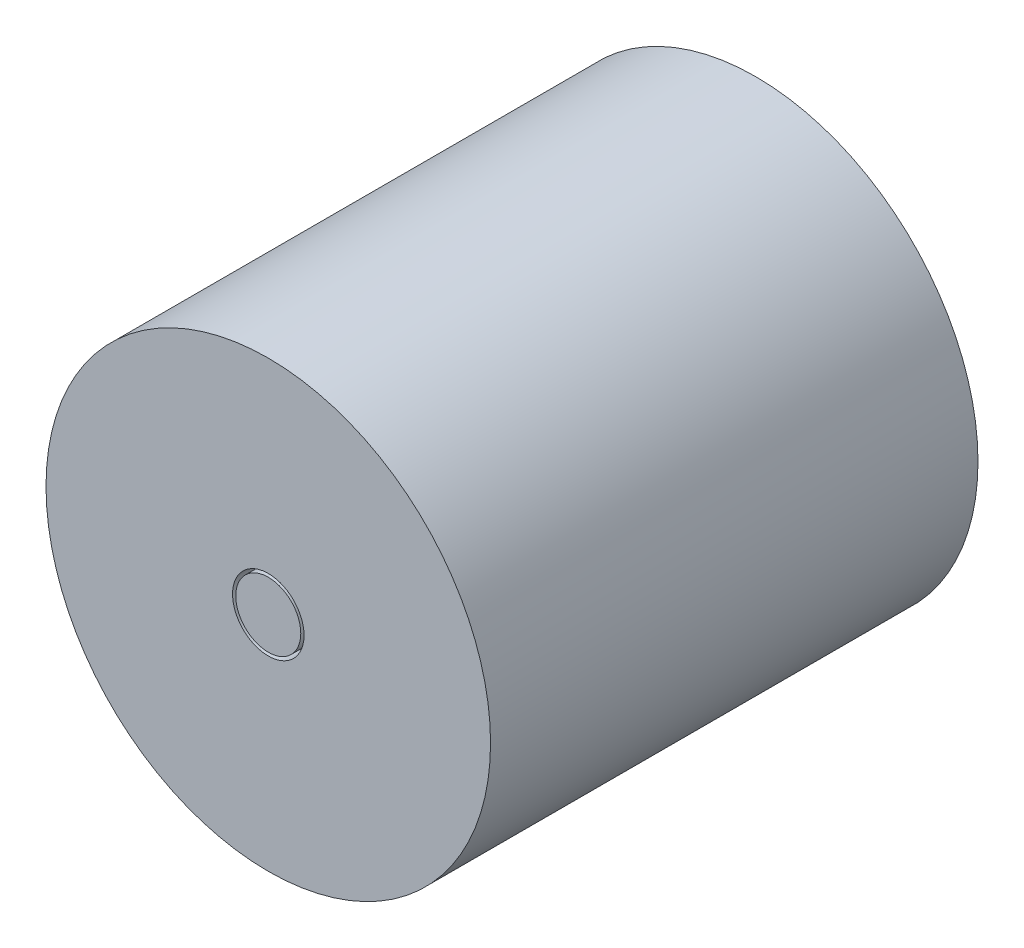
ISO-10303-21;
HEADER;
FILE_DESCRIPTION(('STEP AP214'),'2;1');
FILE_NAME('part.step','',(''),(''),'','','');
FILE_SCHEMA(('AUTOMOTIVE_DESIGN { 1 0 10303 214 1 1 1 1 }'));
ENDSEC;
DATA;
#1=APPLICATION_CONTEXT('core data for automotive mechanical design processes');
#2=APPLICATION_PROTOCOL_DEFINITION('international standard','automotive_design',2000,#1);
#3=PRODUCT_CONTEXT('',#1,'mechanical');
#4=PRODUCT('Part','Part','',(#3));
#5=PRODUCT_RELATED_PRODUCT_CATEGORY('part','',(#4));
#6=PRODUCT_DEFINITION_FORMATION('','',#4);
#7=PRODUCT_DEFINITION_CONTEXT('part definition',#1,'design');
#8=PRODUCT_DEFINITION('design','',#6,#7);
#9=PRODUCT_DEFINITION_SHAPE('','',#8);
#10=(LENGTH_UNIT() NAMED_UNIT(*) SI_UNIT(.MILLI.,.METRE.));
#11=(NAMED_UNIT(*) PLANE_ANGLE_UNIT() SI_UNIT($,.RADIAN.));
#12=(NAMED_UNIT(*) SI_UNIT($,.STERADIAN.) SOLID_ANGLE_UNIT());
#13=UNCERTAINTY_MEASURE_WITH_UNIT(LENGTH_MEASURE(1.E-05),#10,'distance_accuracy_value','');
#14=(GEOMETRIC_REPRESENTATION_CONTEXT(3) GLOBAL_UNCERTAINTY_ASSIGNED_CONTEXT((#13)) GLOBAL_UNIT_ASSIGNED_CONTEXT((#10,
#11,#12)) REPRESENTATION_CONTEXT('',''));
#15=CARTESIAN_POINT('',(0.,0.,0.));
#16=DIRECTION('',(0.,0.,1.));
#17=DIRECTION('',(1.,0.,0.));
#18=AXIS2_PLACEMENT_3D('',#15,#16,#17);
#19=CARTESIAN_POINT('',(0.,0.,0.));
#20=DIRECTION('',(0.,0.,1.));
#21=DIRECTION('',(1.,0.,0.));
#22=AXIS2_PLACEMENT_3D('',#19,#20,#21);
#23=CYLINDRICAL_SURFACE('',#22,0.0684);
#24=CARTESIAN_POINT('',(0.,0.,0.));
#25=DIRECTION('',(0.,0.,1.));
#26=DIRECTION('',(1.,0.,0.));
#27=AXIS2_PLACEMENT_3D('',#24,#25,#26);
#28=CIRCLE('',#27,0.0684);
#29=CARTESIAN_POINT('',(0.0684,0.,0.));
#30=VERTEX_POINT('',#29);
#31=EDGE_CURVE('E12',#30,#30,#28,.T.);
#32=ORIENTED_EDGE('',*,*,#31,.T.);
#33=EDGE_LOOP('',(#32));
#34=FACE_BOUND('',#33,.T.);
#35=CARTESIAN_POINT('',(0.,0.,0.15));
#36=DIRECTION('',(0.,0.,1.));
#37=DIRECTION('',(1.,0.,0.));
#38=AXIS2_PLACEMENT_3D('',#35,#36,#37);
#39=CIRCLE('',#38,0.0684);
#40=CARTESIAN_POINT('',(0.0684,0.,0.15));
#41=VERTEX_POINT('',#40);
#42=EDGE_CURVE('E58',#41,#41,#39,.T.);
#43=ORIENTED_EDGE('',*,*,#42,.F.);
#44=EDGE_LOOP('',(#43));
#45=FACE_BOUND('',#44,.T.);
#46=ADVANCED_FACE('F55',(#34,#45),#23,.T.);
#47=CARTESIAN_POINT('',(0.,0.,0.));
#48=DIRECTION('',(0.,0.,1.));
#49=DIRECTION('',(1.,0.,0.));
#50=AXIS2_PLACEMENT_3D('',#47,#48,#49);
#51=PLANE('',#50);
#52=CARTESIAN_POINT('',(0.,0.,0.));
#53=DIRECTION('',(0.,0.,1.));
#54=DIRECTION('',(1.,0.,0.));
#55=AXIS2_PLACEMENT_3D('',#52,#53,#54);
#56=CIRCLE('',#55,0.011);
#57=CARTESIAN_POINT('',(0.011,0.,0.));
#58=VERTEX_POINT('',#57);
#59=EDGE_CURVE('E67',#58,#58,#56,.T.);
#60=ORIENTED_EDGE('',*,*,#59,.T.);
#61=EDGE_LOOP('',(#60));
#62=FACE_BOUND('',#61,.T.);
#63=ORIENTED_EDGE('',*,*,#31,.F.);
#64=EDGE_LOOP('',(#63));
#65=FACE_BOUND('',#64,.T.);
#66=ADVANCED_FACE('F77',(#62,#65),#51,.F.);
#67=CARTESIAN_POINT('',(0.,0.,0.15));
#68=DIRECTION('',(0.,0.,1.));
#69=DIRECTION('',(1.,0.,0.));
#70=AXIS2_PLACEMENT_3D('',#67,#68,#69);
#71=PLANE('',#70);
#72=CARTESIAN_POINT('',(0.,0.,0.15));
#73=DIRECTION('',(0.,0.,1.));
#74=DIRECTION('',(1.,0.,0.));
#75=AXIS2_PLACEMENT_3D('',#72,#73,#74);
#76=CIRCLE('',#75,0.011);
#77=CARTESIAN_POINT('',(0.011,0.,0.15));
#78=VERTEX_POINT('',#77);
#79=EDGE_CURVE('E69',#78,#78,#76,.T.);
#80=ORIENTED_EDGE('',*,*,#79,.F.);
#81=EDGE_LOOP('',(#80));
#82=FACE_BOUND('',#81,.T.);
#83=ORIENTED_EDGE('',*,*,#42,.T.);
#84=EDGE_LOOP('',(#83));
#85=FACE_BOUND('',#84,.T.);
#86=ADVANCED_FACE('F83',(#82,#85),#71,.T.);
#87=CARTESIAN_POINT('',(0.,0.,0.));
#88=DIRECTION('',(0.,0.,1.));
#89=DIRECTION('',(1.,0.,0.));
#90=AXIS2_PLACEMENT_3D('',#87,#88,#89);
#91=CYLINDRICAL_SURFACE('',#90,0.011);
#92=ORIENTED_EDGE('',*,*,#59,.F.);
#93=EDGE_LOOP('',(#92));
#94=FACE_BOUND('',#93,.T.);
#95=ORIENTED_EDGE('',*,*,#79,.T.);
#96=EDGE_LOOP('',(#95));
#97=FACE_BOUND('',#96,.T.);
#98=ADVANCED_FACE('F80',(#94,#97),#91,.F.);
#99=CLOSED_SHELL('',(#46,#66,#86,#98));
#100=MANIFOLD_SOLID_BREP('B2',#99);
#101=CARTESIAN_POINT('',(0.,0.,0.15));
#102=DIRECTION('',(0.,0.,-1.));
#103=DIRECTION('',(-1.,0.,0.));
#104=AXIS2_PLACEMENT_3D('',#101,#102,#103);
#105=CYLINDRICAL_SURFACE('',#104,0.00999999999999959);
#106=CARTESIAN_POINT('',(0.,0.,0.15));
#107=DIRECTION('',(0.,0.,1.));
#108=DIRECTION('',(1.,0.,0.));
#109=AXIS2_PLACEMENT_3D('',#106,#107,#108);
#110=CIRCLE('',#109,0.00999999999999959);
#111=CARTESIAN_POINT('',(0.00999999999999959,0.,0.15));
#112=VERTEX_POINT('',#111);
#113=EDGE_CURVE('E54',#112,#112,#110,.T.);
#114=ORIENTED_EDGE('',*,*,#113,.F.);
#115=EDGE_LOOP('',(#114));
#116=FACE_BOUND('',#115,.T.);
#117=CARTESIAN_POINT('',(0.,0.,0.));
#118=DIRECTION('',(0.,0.,1.));
#119=DIRECTION('',(1.,0.,0.));
#120=AXIS2_PLACEMENT_3D('',#117,#118,#119);
#121=CIRCLE('',#120,0.00999999999999959);
#122=CARTESIAN_POINT('',(0.00999999999999959,0.,0.));
#123=VERTEX_POINT('',#122);
#124=EDGE_CURVE('E132',#123,#123,#121,.T.);
#125=ORIENTED_EDGE('',*,*,#124,.T.);
#126=EDGE_LOOP('',(#125));
#127=FACE_BOUND('',#126,.T.);
#128=ADVANCED_FACE('F129',(#116,#127),#105,.T.);
#129=CARTESIAN_POINT('',(0.,0.,0.15));
#130=DIRECTION('',(0.,0.,1.));
#131=DIRECTION('',(1.,0.,0.));
#132=AXIS2_PLACEMENT_3D('',#129,#130,#131);
#133=PLANE('',#132);
#134=ORIENTED_EDGE('',*,*,#113,.T.);
#135=EDGE_LOOP('',(#134));
#136=FACE_BOUND('',#135,.T.);
#137=ADVANCED_FACE('F144',(#136),#133,.T.);
#138=CARTESIAN_POINT('',(0.,0.,0.));
#139=DIRECTION('',(0.,0.,1.));
#140=DIRECTION('',(1.,0.,0.));
#141=AXIS2_PLACEMENT_3D('',#138,#139,#140);
#142=PLANE('',#141);
#143=ORIENTED_EDGE('',*,*,#124,.F.);
#144=EDGE_LOOP('',(#143));
#145=FACE_BOUND('',#144,.T.);
#146=ADVANCED_FACE('F142',(#145),#142,.F.);
#147=CLOSED_SHELL('',(#128,#137,#146));
#148=MANIFOLD_SOLID_BREP('B7',#147);
#149=ADVANCED_BREP_SHAPE_REPRESENTATION('',(#18,#100,#148),#14);
#150=SHAPE_DEFINITION_REPRESENTATION(#9,#149);
ENDSEC;
END-ISO-10303-21;
